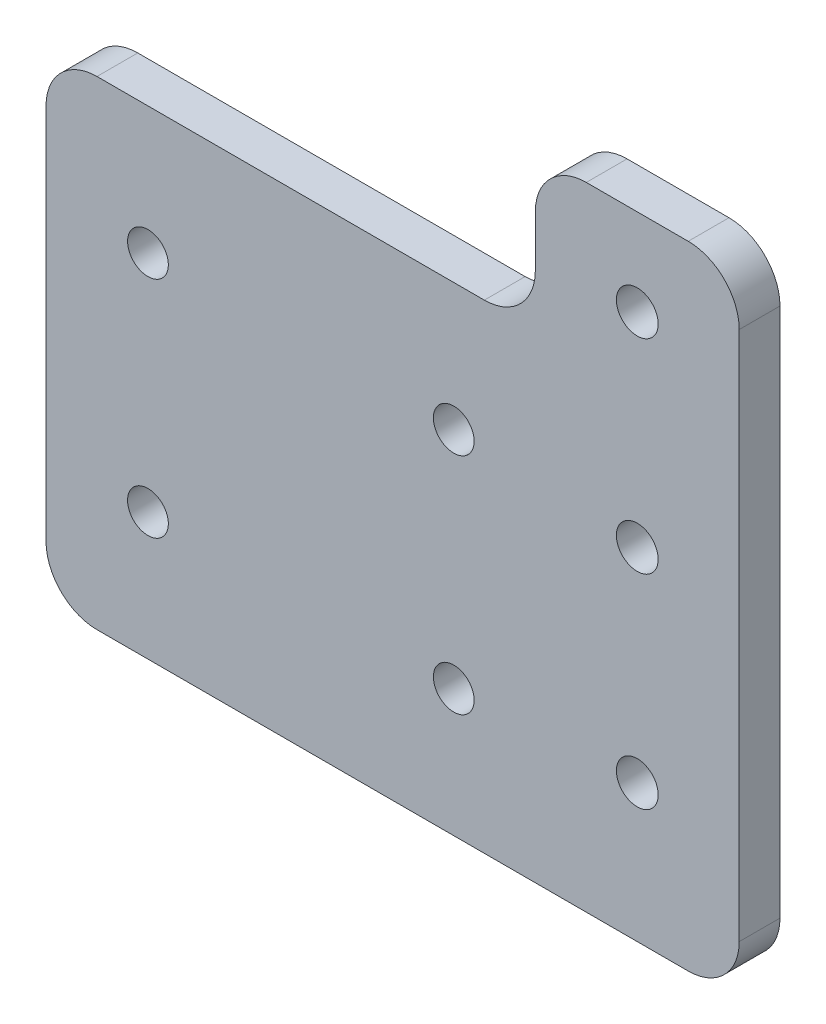
ISO-10303-21;
HEADER;
FILE_DESCRIPTION(('STEP AP214'),'2;1');
FILE_NAME('part.step','',(''),(''),'','','');
FILE_SCHEMA(('AUTOMOTIVE_DESIGN { 1 0 10303 214 1 1 1 1 }'));
ENDSEC;
DATA;
#1=APPLICATION_CONTEXT('core data for automotive mechanical design processes');
#2=APPLICATION_PROTOCOL_DEFINITION('international standard','automotive_design',2000,#1);
#3=PRODUCT_CONTEXT('',#1,'mechanical');
#4=PRODUCT('Part','Part','',(#3));
#5=PRODUCT_RELATED_PRODUCT_CATEGORY('part','',(#4));
#6=PRODUCT_DEFINITION_FORMATION('','',#4);
#7=PRODUCT_DEFINITION_CONTEXT('part definition',#1,'design');
#8=PRODUCT_DEFINITION('design','',#6,#7);
#9=PRODUCT_DEFINITION_SHAPE('','',#8);
#10=(LENGTH_UNIT() NAMED_UNIT(*) SI_UNIT(.MILLI.,.METRE.));
#11=(NAMED_UNIT(*) PLANE_ANGLE_UNIT() SI_UNIT($,.RADIAN.));
#12=(NAMED_UNIT(*) SI_UNIT($,.STERADIAN.) SOLID_ANGLE_UNIT());
#13=UNCERTAINTY_MEASURE_WITH_UNIT(LENGTH_MEASURE(1.E-05),#10,'distance_accuracy_value','');
#14=(GEOMETRIC_REPRESENTATION_CONTEXT(3) GLOBAL_UNCERTAINTY_ASSIGNED_CONTEXT((#13)) GLOBAL_UNIT_ASSIGNED_CONTEXT((#10,
#11,#12)) REPRESENTATION_CONTEXT('',''));
#15=CARTESIAN_POINT('',(0.,0.,0.));
#16=DIRECTION('',(0.,0.,1.));
#17=DIRECTION('',(1.,0.,0.));
#18=AXIS2_PLACEMENT_3D('',#15,#16,#17);
#19=CARTESIAN_POINT('',(0.,47.,4.));
#20=DIRECTION('',(0.,-1.,0.));
#21=DIRECTION('',(0.,0.,-1.));
#22=AXIS2_PLACEMENT_3D('',#19,#20,#21);
#23=PLANE('',#22);
#24=DIRECTION('',(-1.,0.,0.));
#25=VECTOR('',#24,1.);
#26=CARTESIAN_POINT('',(0.,47.,4.));
#27=LINE('',#26,#25);
#28=CARTESIAN_POINT('',(43.,47.,4.));
#29=VERTEX_POINT('',#28);
#30=CARTESIAN_POINT('',(4.99999999999998,47.,4.));
#31=VERTEX_POINT('',#30);
#32=EDGE_CURVE('E172',#29,#31,#27,.T.);
#33=ORIENTED_EDGE('',*,*,#32,.F.);
#34=DIRECTION('',(0.,0.,1.));
#35=VECTOR('',#34,1.);
#36=CARTESIAN_POINT('',(43.,47.,4.));
#37=LINE('',#36,#35);
#38=CARTESIAN_POINT('',(43.,47.,0.));
#39=VERTEX_POINT('',#38);
#40=EDGE_CURVE('E210',#29,#39,#37,.F.);
#41=ORIENTED_EDGE('',*,*,#40,.T.);
#42=DIRECTION('',(-1.,0.,0.));
#43=VECTOR('',#42,1.);
#44=CARTESIAN_POINT('',(0.,47.,0.));
#45=LINE('',#44,#43);
#46=CARTESIAN_POINT('',(4.99999999999998,47.,0.));
#47=VERTEX_POINT('',#46);
#48=EDGE_CURVE('E159',#39,#47,#45,.T.);
#49=ORIENTED_EDGE('',*,*,#48,.T.);
#50=DIRECTION('',(0.,0.,-1.));
#51=VECTOR('',#50,1.);
#52=CARTESIAN_POINT('',(4.99999999999998,47.,4.));
#53=LINE('',#52,#51);
#54=EDGE_CURVE('E56',#47,#31,#53,.F.);
#55=ORIENTED_EDGE('',*,*,#54,.T.);
#56=EDGE_LOOP('',(#33,#41,#49,#55));
#57=FACE_BOUND('',#56,.T.);
#58=ADVANCED_FACE('F41',(#57),#23,.F.);
#59=CARTESIAN_POINT('',(0.,0.,4.));
#60=DIRECTION('',(1.,0.,0.));
#61=DIRECTION('',(0.,1.,0.));
#62=AXIS2_PLACEMENT_3D('',#59,#60,#61);
#63=PLANE('',#62);
#64=DIRECTION('',(0.,-1.,0.));
#65=VECTOR('',#64,1.);
#66=CARTESIAN_POINT('',(0.,0.,0.));
#67=LINE('',#66,#65);
#68=CARTESIAN_POINT('',(0.,42.,0.));
#69=VERTEX_POINT('',#68);
#70=CARTESIAN_POINT('',(0.,5.,0.));
#71=VERTEX_POINT('',#70);
#72=EDGE_CURVE('E156',#69,#71,#67,.T.);
#73=ORIENTED_EDGE('',*,*,#72,.T.);
#74=DIRECTION('',(0.,0.,-1.));
#75=VECTOR('',#74,1.);
#76=CARTESIAN_POINT('',(0.,5.,4.));
#77=LINE('',#76,#75);
#78=CARTESIAN_POINT('',(0.,5.,4.));
#79=VERTEX_POINT('',#78);
#80=EDGE_CURVE('E134',#71,#79,#77,.F.);
#81=ORIENTED_EDGE('',*,*,#80,.T.);
#82=DIRECTION('',(0.,-1.,0.));
#83=VECTOR('',#82,1.);
#84=CARTESIAN_POINT('',(0.,0.,4.));
#85=LINE('',#84,#83);
#86=CARTESIAN_POINT('',(0.,42.,4.));
#87=VERTEX_POINT('',#86);
#88=EDGE_CURVE('E166',#87,#79,#85,.T.);
#89=ORIENTED_EDGE('',*,*,#88,.F.);
#90=DIRECTION('',(0.,0.,-1.));
#91=VECTOR('',#90,1.);
#92=CARTESIAN_POINT('',(0.,42.,4.));
#93=LINE('',#92,#91);
#94=EDGE_CURVE('E139',#87,#69,#93,.T.);
#95=ORIENTED_EDGE('',*,*,#94,.T.);
#96=EDGE_LOOP('',(#73,#81,#89,#95));
#97=FACE_BOUND('',#96,.T.);
#98=ADVANCED_FACE('F280',(#97),#63,.F.);
#99=CARTESIAN_POINT('',(0.,0.,4.));
#100=DIRECTION('',(0.,1.,0.));
#101=DIRECTION('',(0.,0.,1.));
#102=AXIS2_PLACEMENT_3D('',#99,#100,#101);
#103=PLANE('',#102);
#104=DIRECTION('',(1.,0.,0.));
#105=VECTOR('',#104,1.);
#106=CARTESIAN_POINT('',(0.,0.,4.));
#107=LINE('',#106,#105);
#108=CARTESIAN_POINT('',(5.,0.,4.));
#109=VERTEX_POINT('',#108);
#110=CARTESIAN_POINT('',(63.,0.,4.));
#111=VERTEX_POINT('',#110);
#112=EDGE_CURVE('E149',#109,#111,#107,.T.);
#113=ORIENTED_EDGE('',*,*,#112,.F.);
#114=DIRECTION('',(0.,0.,-1.));
#115=VECTOR('',#114,1.);
#116=CARTESIAN_POINT('',(5.,0.,4.));
#117=LINE('',#116,#115);
#118=CARTESIAN_POINT('',(5.,0.,0.));
#119=VERTEX_POINT('',#118);
#120=EDGE_CURVE('E133',#109,#119,#117,.T.);
#121=ORIENTED_EDGE('',*,*,#120,.T.);
#122=DIRECTION('',(1.,0.,0.));
#123=VECTOR('',#122,1.);
#124=CARTESIAN_POINT('',(0.,0.,0.));
#125=LINE('',#124,#123);
#126=CARTESIAN_POINT('',(63.,0.,0.));
#127=VERTEX_POINT('',#126);
#128=EDGE_CURVE('E146',#119,#127,#125,.T.);
#129=ORIENTED_EDGE('',*,*,#128,.T.);
#130=DIRECTION('',(0.,0.,-1.));
#131=VECTOR('',#130,1.);
#132=CARTESIAN_POINT('',(63.,0.,4.));
#133=LINE('',#132,#131);
#134=EDGE_CURVE('E151',#127,#111,#133,.F.);
#135=ORIENTED_EDGE('',*,*,#134,.T.);
#136=EDGE_LOOP('',(#113,#121,#129,#135));
#137=FACE_BOUND('',#136,.T.);
#138=ADVANCED_FACE('F145',(#137),#103,.F.);
#139=CARTESIAN_POINT('',(68.,0.,4.));
#140=DIRECTION('',(-1.,0.,0.));
#141=DIRECTION('',(0.,-1.,0.));
#142=AXIS2_PLACEMENT_3D('',#139,#140,#141);
#143=PLANE('',#142);
#144=DIRECTION('',(0.,1.,0.));
#145=VECTOR('',#144,1.);
#146=CARTESIAN_POINT('',(68.,0.,4.));
#147=LINE('',#146,#145);
#148=CARTESIAN_POINT('',(68.,5.,4.));
#149=VERTEX_POINT('',#148);
#150=CARTESIAN_POINT('',(68.,57.,4.));
#151=VERTEX_POINT('',#150);
#152=EDGE_CURVE('E272',#149,#151,#147,.T.);
#153=ORIENTED_EDGE('',*,*,#152,.F.);
#154=DIRECTION('',(0.,0.,-1.));
#155=VECTOR('',#154,1.);
#156=CARTESIAN_POINT('',(68.,5.,4.));
#157=LINE('',#156,#155);
#158=CARTESIAN_POINT('',(68.,5.,0.));
#159=VERTEX_POINT('',#158);
#160=EDGE_CURVE('E196',#149,#159,#157,.T.);
#161=ORIENTED_EDGE('',*,*,#160,.T.);
#162=DIRECTION('',(0.,1.,0.));
#163=VECTOR('',#162,1.);
#164=CARTESIAN_POINT('',(68.,0.,0.));
#165=LINE('',#164,#163);
#166=CARTESIAN_POINT('',(68.,57.,0.));
#167=VERTEX_POINT('',#166);
#168=EDGE_CURVE('E155',#159,#167,#165,.T.);
#169=ORIENTED_EDGE('',*,*,#168,.T.);
#170=DIRECTION('',(0.,0.,1.));
#171=VECTOR('',#170,1.);
#172=CARTESIAN_POINT('',(68.,57.,4.));
#173=LINE('',#172,#171);
#174=EDGE_CURVE('E193',#167,#151,#173,.T.);
#175=ORIENTED_EDGE('',*,*,#174,.T.);
#176=EDGE_LOOP('',(#153,#161,#169,#175));
#177=FACE_BOUND('',#176,.T.);
#178=ADVANCED_FACE('F287',(#177),#143,.F.);
#179=CARTESIAN_POINT('',(0.,0.,4.));
#180=DIRECTION('',(0.,0.,-1.));
#181=DIRECTION('',(-1.,0.,0.));
#182=AXIS2_PLACEMENT_3D('',#179,#180,#181);
#183=PLANE('',#182);
#184=CARTESIAN_POINT('',(57.9999999999999,53.5,4.));
#185=DIRECTION('',(0.,0.,1.));
#186=DIRECTION('',(1.,0.,0.));
#187=AXIS2_PLACEMENT_3D('',#184,#185,#186);
#188=CIRCLE('',#187,2.04999999999999);
#189=CARTESIAN_POINT('',(60.0499999999999,53.5,4.));
#190=VERTEX_POINT('',#189);
#191=EDGE_CURVE('E171',#190,#190,#188,.T.);
#192=ORIENTED_EDGE('',*,*,#191,.F.);
#193=EDGE_LOOP('',(#192));
#194=FACE_BOUND('',#193,.T.);
#195=CARTESIAN_POINT('',(40.,12.5,4.));
#196=DIRECTION('',(0.,0.,1.));
#197=DIRECTION('',(-1.,0.,0.));
#198=AXIS2_PLACEMENT_3D('',#195,#196,#197);
#199=CIRCLE('',#198,2.);
#200=CARTESIAN_POINT('',(38.,12.5,4.));
#201=VERTEX_POINT('',#200);
#202=EDGE_CURVE('E249',#201,#201,#199,.T.);
#203=ORIENTED_EDGE('',*,*,#202,.F.);
#204=EDGE_LOOP('',(#203));
#205=FACE_BOUND('',#204,.T.);
#206=CARTESIAN_POINT('',(40.,34.5,4.));
#207=DIRECTION('',(0.,0.,1.));
#208=DIRECTION('',(1.,0.,0.));
#209=AXIS2_PLACEMENT_3D('',#206,#207,#208);
#210=CIRCLE('',#209,2.);
#211=CARTESIAN_POINT('',(42.,34.5,4.));
#212=VERTEX_POINT('',#211);
#213=EDGE_CURVE('E242',#212,#212,#210,.T.);
#214=ORIENTED_EDGE('',*,*,#213,.F.);
#215=EDGE_LOOP('',(#214));
#216=FACE_BOUND('',#215,.T.);
#217=CARTESIAN_POINT('',(58.,33.5,4.));
#218=DIRECTION('',(0.,0.,1.));
#219=DIRECTION('',(1.,0.,0.));
#220=AXIS2_PLACEMENT_3D('',#217,#218,#219);
#221=CIRCLE('',#220,2.04999999999999);
#222=CARTESIAN_POINT('',(60.05,33.5,4.));
#223=VERTEX_POINT('',#222);
#224=EDGE_CURVE('E261',#223,#223,#221,.T.);
#225=ORIENTED_EDGE('',*,*,#224,.F.);
#226=EDGE_LOOP('',(#225));
#227=FACE_BOUND('',#226,.T.);
#228=CARTESIAN_POINT('',(10.,12.5,4.));
#229=DIRECTION('',(0.,0.,1.));
#230=DIRECTION('',(-1.,0.,0.));
#231=AXIS2_PLACEMENT_3D('',#228,#229,#230);
#232=CIRCLE('',#231,2.);
#233=CARTESIAN_POINT('',(8.,12.5,4.));
#234=VERTEX_POINT('',#233);
#235=EDGE_CURVE('E254',#234,#234,#232,.T.);
#236=ORIENTED_EDGE('',*,*,#235,.F.);
#237=EDGE_LOOP('',(#236));
#238=FACE_BOUND('',#237,.T.);
#239=CARTESIAN_POINT('',(58.,13.5,4.));
#240=DIRECTION('',(0.,0.,1.));
#241=DIRECTION('',(-1.,0.,0.));
#242=AXIS2_PLACEMENT_3D('',#239,#240,#241);
#243=CIRCLE('',#242,2.04999999999999);
#244=CARTESIAN_POINT('',(55.95,13.5,4.));
#245=VERTEX_POINT('',#244);
#246=EDGE_CURVE('E235',#245,#245,#243,.T.);
#247=ORIENTED_EDGE('',*,*,#246,.F.);
#248=EDGE_LOOP('',(#247));
#249=FACE_BOUND('',#248,.T.);
#250=CARTESIAN_POINT('',(10.,34.5,4.));
#251=DIRECTION('',(0.,0.,1.));
#252=DIRECTION('',(1.,0.,0.));
#253=AXIS2_PLACEMENT_3D('',#250,#251,#252);
#254=CIRCLE('',#253,2.);
#255=CARTESIAN_POINT('',(12.,34.5,4.));
#256=VERTEX_POINT('',#255);
#257=EDGE_CURVE('E257',#256,#256,#254,.T.);
#258=ORIENTED_EDGE('',*,*,#257,.F.);
#259=EDGE_LOOP('',(#258));
#260=FACE_BOUND('',#259,.T.);
#261=ORIENTED_EDGE('',*,*,#88,.T.);
#262=CARTESIAN_POINT('',(5.,5.,4.));
#263=DIRECTION('',(0.,0.,-1.));
#264=DIRECTION('',(-1.,0.,0.));
#265=AXIS2_PLACEMENT_3D('',#262,#263,#264);
#266=CIRCLE('',#265,5.);
#267=EDGE_CURVE('E191',#79,#109,#266,.F.);
#268=ORIENTED_EDGE('',*,*,#267,.T.);
#269=ORIENTED_EDGE('',*,*,#112,.T.);
#270=CARTESIAN_POINT('',(63.,5.,4.));
#271=DIRECTION('',(0.,0.,-1.));
#272=DIRECTION('',(-1.,0.,0.));
#273=AXIS2_PLACEMENT_3D('',#270,#271,#272);
#274=CIRCLE('',#273,5.);
#275=EDGE_CURVE('E189',#111,#149,#274,.F.);
#276=ORIENTED_EDGE('',*,*,#275,.T.);
#277=ORIENTED_EDGE('',*,*,#152,.T.);
#278=CARTESIAN_POINT('',(63.,57.,4.));
#279=DIRECTION('',(0.,0.,-1.));
#280=DIRECTION('',(-1.,0.,0.));
#281=AXIS2_PLACEMENT_3D('',#278,#279,#280);
#282=CIRCLE('',#281,5.);
#283=CARTESIAN_POINT('',(63.,62.,4.));
#284=VERTEX_POINT('',#283);
#285=EDGE_CURVE('E183',#151,#284,#282,.F.);
#286=ORIENTED_EDGE('',*,*,#285,.T.);
#287=DIRECTION('',(-1.,0.,0.));
#288=VECTOR('',#287,1.);
#289=CARTESIAN_POINT('',(68.,62.,4.));
#290=LINE('',#289,#288);
#291=CARTESIAN_POINT('',(53.,62.,4.));
#292=VERTEX_POINT('',#291);
#293=EDGE_CURVE('E170',#284,#292,#290,.T.);
#294=ORIENTED_EDGE('',*,*,#293,.T.);
#295=CARTESIAN_POINT('',(53.,57.,4.));
#296=DIRECTION('',(0.,0.,-1.));
#297=DIRECTION('',(-1.,0.,0.));
#298=AXIS2_PLACEMENT_3D('',#295,#296,#297);
#299=CIRCLE('',#298,5.);
#300=CARTESIAN_POINT('',(48.,57.,4.));
#301=VERTEX_POINT('',#300);
#302=EDGE_CURVE('E187',#292,#301,#299,.F.);
#303=ORIENTED_EDGE('',*,*,#302,.T.);
#304=DIRECTION('',(0.,-1.,0.));
#305=VECTOR('',#304,1.);
#306=CARTESIAN_POINT('',(48.,47.,4.));
#307=LINE('',#306,#305);
#308=CARTESIAN_POINT('',(48.,52.,4.));
#309=VERTEX_POINT('',#308);
#310=EDGE_CURVE('E222',#301,#309,#307,.T.);
#311=ORIENTED_EDGE('',*,*,#310,.T.);
#312=CARTESIAN_POINT('',(43.,52.,4.));
#313=DIRECTION('',(0.,0.,-1.));
#314=DIRECTION('',(-1.,0.,0.));
#315=AXIS2_PLACEMENT_3D('',#312,#313,#314);
#316=CIRCLE('',#315,5.);
#317=EDGE_CURVE('E49',#309,#29,#316,.T.);
#318=ORIENTED_EDGE('',*,*,#317,.T.);
#319=ORIENTED_EDGE('',*,*,#32,.T.);
#320=CARTESIAN_POINT('',(4.99999999999998,42.,4.));
#321=DIRECTION('',(0.,0.,-1.));
#322=DIRECTION('',(-1.,0.,0.));
#323=AXIS2_PLACEMENT_3D('',#320,#321,#322);
#324=CIRCLE('',#323,5.);
#325=EDGE_CURVE('E185',#31,#87,#324,.F.);
#326=ORIENTED_EDGE('',*,*,#325,.T.);
#327=EDGE_LOOP('',(#261,#268,#269,#276,#277,#286,#294,#303,#311,#318,#319,#326));
#328=FACE_BOUND('',#327,.T.);
#329=ADVANCED_FACE('F226',(#194,#205,#216,#227,#238,#249,#260,#328),#183,.F.);
#330=CARTESIAN_POINT('',(0.,0.,0.));
#331=DIRECTION('',(0.,0.,-1.));
#332=DIRECTION('',(-1.,0.,0.));
#333=AXIS2_PLACEMENT_3D('',#330,#331,#332);
#334=PLANE('',#333);
#335=CARTESIAN_POINT('',(57.9999999999999,53.5,0.));
#336=DIRECTION('',(0.,0.,-1.));
#337=DIRECTION('',(-1.,0.,0.));
#338=AXIS2_PLACEMENT_3D('',#335,#336,#337);
#339=CIRCLE('',#338,2.04999999999999);
#340=CARTESIAN_POINT('',(55.9499999999999,53.5,0.));
#341=VERTEX_POINT('',#340);
#342=EDGE_CURVE('E167',#341,#341,#339,.T.);
#343=ORIENTED_EDGE('',*,*,#342,.F.);
#344=EDGE_LOOP('',(#343));
#345=FACE_BOUND('',#344,.T.);
#346=CARTESIAN_POINT('',(40.,12.5,0.));
#347=DIRECTION('',(0.,0.,1.));
#348=DIRECTION('',(-1.,0.,0.));
#349=AXIS2_PLACEMENT_3D('',#346,#347,#348);
#350=CIRCLE('',#349,2.);
#351=CARTESIAN_POINT('',(38.,12.5,0.));
#352=VERTEX_POINT('',#351);
#353=EDGE_CURVE('E238',#352,#352,#350,.T.);
#354=ORIENTED_EDGE('',*,*,#353,.T.);
#355=EDGE_LOOP('',(#354));
#356=FACE_BOUND('',#355,.T.);
#357=CARTESIAN_POINT('',(40.,34.5,0.));
#358=DIRECTION('',(0.,0.,1.));
#359=DIRECTION('',(1.,0.,0.));
#360=AXIS2_PLACEMENT_3D('',#357,#358,#359);
#361=CIRCLE('',#360,2.);
#362=CARTESIAN_POINT('',(42.,34.5,0.));
#363=VERTEX_POINT('',#362);
#364=EDGE_CURVE('E246',#363,#363,#361,.T.);
#365=ORIENTED_EDGE('',*,*,#364,.T.);
#366=EDGE_LOOP('',(#365));
#367=FACE_BOUND('',#366,.T.);
#368=CARTESIAN_POINT('',(58.,33.5,0.));
#369=DIRECTION('',(0.,0.,1.));
#370=DIRECTION('',(1.,0.,0.));
#371=AXIS2_PLACEMENT_3D('',#368,#369,#370);
#372=CIRCLE('',#371,2.04999999999999);
#373=CARTESIAN_POINT('',(60.05,33.5,0.));
#374=VERTEX_POINT('',#373);
#375=EDGE_CURVE('E245',#374,#374,#372,.T.);
#376=ORIENTED_EDGE('',*,*,#375,.T.);
#377=EDGE_LOOP('',(#376));
#378=FACE_BOUND('',#377,.T.);
#379=CARTESIAN_POINT('',(10.,12.5,0.));
#380=DIRECTION('',(0.,0.,1.));
#381=DIRECTION('',(-1.,0.,0.));
#382=AXIS2_PLACEMENT_3D('',#379,#380,#381);
#383=CIRCLE('',#382,2.);
#384=CARTESIAN_POINT('',(8.,12.5,0.));
#385=VERTEX_POINT('',#384);
#386=EDGE_CURVE('E258',#385,#385,#383,.T.);
#387=ORIENTED_EDGE('',*,*,#386,.T.);
#388=EDGE_LOOP('',(#387));
#389=FACE_BOUND('',#388,.T.);
#390=CARTESIAN_POINT('',(58.,13.5,0.));
#391=DIRECTION('',(0.,0.,1.));
#392=DIRECTION('',(-1.,0.,0.));
#393=AXIS2_PLACEMENT_3D('',#390,#391,#392);
#394=CIRCLE('',#393,2.04999999999999);
#395=CARTESIAN_POINT('',(55.95,13.5,0.));
#396=VERTEX_POINT('',#395);
#397=EDGE_CURVE('E239',#396,#396,#394,.T.);
#398=ORIENTED_EDGE('',*,*,#397,.T.);
#399=EDGE_LOOP('',(#398));
#400=FACE_BOUND('',#399,.T.);
#401=CARTESIAN_POINT('',(10.,34.5,0.));
#402=DIRECTION('',(0.,0.,1.));
#403=DIRECTION('',(1.,0.,0.));
#404=AXIS2_PLACEMENT_3D('',#401,#402,#403);
#405=CIRCLE('',#404,2.);
#406=CARTESIAN_POINT('',(12.,34.5,0.));
#407=VERTEX_POINT('',#406);
#408=EDGE_CURVE('E161',#407,#407,#405,.T.);
#409=ORIENTED_EDGE('',*,*,#408,.T.);
#410=EDGE_LOOP('',(#409));
#411=FACE_BOUND('',#410,.T.);
#412=ORIENTED_EDGE('',*,*,#128,.F.);
#413=CARTESIAN_POINT('',(5.,5.,0.));
#414=DIRECTION('',(0.,0.,-1.));
#415=DIRECTION('',(-1.,0.,0.));
#416=AXIS2_PLACEMENT_3D('',#413,#414,#415);
#417=CIRCLE('',#416,5.);
#418=EDGE_CURVE('E129',#119,#71,#417,.T.);
#419=ORIENTED_EDGE('',*,*,#418,.T.);
#420=ORIENTED_EDGE('',*,*,#72,.F.);
#421=CARTESIAN_POINT('',(4.99999999999998,42.,0.));
#422=DIRECTION('',(0.,0.,-1.));
#423=DIRECTION('',(-1.,0.,0.));
#424=AXIS2_PLACEMENT_3D('',#421,#422,#423);
#425=CIRCLE('',#424,5.);
#426=EDGE_CURVE('E175',#69,#47,#425,.T.);
#427=ORIENTED_EDGE('',*,*,#426,.T.);
#428=ORIENTED_EDGE('',*,*,#48,.F.);
#429=CARTESIAN_POINT('',(43.,52.,0.));
#430=DIRECTION('',(0.,0.,-1.));
#431=DIRECTION('',(-1.,0.,0.));
#432=AXIS2_PLACEMENT_3D('',#429,#430,#431);
#433=CIRCLE('',#432,5.);
#434=CARTESIAN_POINT('',(48.,52.,0.));
#435=VERTEX_POINT('',#434);
#436=EDGE_CURVE('E11',#39,#435,#433,.F.);
#437=ORIENTED_EDGE('',*,*,#436,.T.);
#438=DIRECTION('',(0.,-1.,0.));
#439=VECTOR('',#438,1.);
#440=CARTESIAN_POINT('',(48.,47.,0.));
#441=LINE('',#440,#439);
#442=CARTESIAN_POINT('',(48.,57.,0.));
#443=VERTEX_POINT('',#442);
#444=EDGE_CURVE('E224',#443,#435,#441,.T.);
#445=ORIENTED_EDGE('',*,*,#444,.F.);
#446=CARTESIAN_POINT('',(53.,57.,0.));
#447=DIRECTION('',(0.,0.,-1.));
#448=DIRECTION('',(-1.,0.,0.));
#449=AXIS2_PLACEMENT_3D('',#446,#447,#448);
#450=CIRCLE('',#449,5.);
#451=CARTESIAN_POINT('',(53.,62.,0.));
#452=VERTEX_POINT('',#451);
#453=EDGE_CURVE('E177',#443,#452,#450,.T.);
#454=ORIENTED_EDGE('',*,*,#453,.T.);
#455=DIRECTION('',(-1.,0.,0.));
#456=VECTOR('',#455,1.);
#457=CARTESIAN_POINT('',(68.,62.,0.));
#458=LINE('',#457,#456);
#459=CARTESIAN_POINT('',(63.,62.,0.));
#460=VERTEX_POINT('',#459);
#461=EDGE_CURVE('E228',#460,#452,#458,.T.);
#462=ORIENTED_EDGE('',*,*,#461,.F.);
#463=CARTESIAN_POINT('',(63.,57.,0.));
#464=DIRECTION('',(0.,0.,-1.));
#465=DIRECTION('',(-1.,0.,0.));
#466=AXIS2_PLACEMENT_3D('',#463,#464,#465);
#467=CIRCLE('',#466,5.);
#468=EDGE_CURVE('E150',#460,#167,#467,.T.);
#469=ORIENTED_EDGE('',*,*,#468,.T.);
#470=ORIENTED_EDGE('',*,*,#168,.F.);
#471=CARTESIAN_POINT('',(63.,5.,0.));
#472=DIRECTION('',(0.,0.,-1.));
#473=DIRECTION('',(-1.,0.,0.));
#474=AXIS2_PLACEMENT_3D('',#471,#472,#473);
#475=CIRCLE('',#474,5.);
#476=EDGE_CURVE('E140',#159,#127,#475,.T.);
#477=ORIENTED_EDGE('',*,*,#476,.T.);
#478=EDGE_LOOP('',(#412,#419,#420,#427,#428,#437,#445,#454,#462,#469,#470,#477));
#479=FACE_BOUND('',#478,.T.);
#480=ADVANCED_FACE('F153',(#345,#356,#367,#378,#389,#400,#411,#479),#334,.T.);
#481=CARTESIAN_POINT('',(10.,34.5,0.));
#482=DIRECTION('',(0.,0.,1.));
#483=DIRECTION('',(1.,0.,0.));
#484=AXIS2_PLACEMENT_3D('',#481,#482,#483);
#485=CYLINDRICAL_SURFACE('',#484,2.);
#486=ORIENTED_EDGE('',*,*,#408,.F.);
#487=EDGE_LOOP('',(#486));
#488=FACE_BOUND('',#487,.T.);
#489=ORIENTED_EDGE('',*,*,#257,.T.);
#490=EDGE_LOOP('',(#489));
#491=FACE_BOUND('',#490,.T.);
#492=ADVANCED_FACE('F321',(#488,#491),#485,.F.);
#493=CARTESIAN_POINT('',(58.,13.5,0.));
#494=DIRECTION('',(0.,0.,1.));
#495=DIRECTION('',(1.,0.,0.));
#496=AXIS2_PLACEMENT_3D('',#493,#494,#495);
#497=CYLINDRICAL_SURFACE('',#496,2.04999999999999);
#498=ORIENTED_EDGE('',*,*,#397,.F.);
#499=EDGE_LOOP('',(#498));
#500=FACE_BOUND('',#499,.T.);
#501=ORIENTED_EDGE('',*,*,#246,.T.);
#502=EDGE_LOOP('',(#501));
#503=FACE_BOUND('',#502,.T.);
#504=ADVANCED_FACE('F323',(#500,#503),#497,.F.);
#505=CARTESIAN_POINT('',(10.,12.5,0.));
#506=DIRECTION('',(0.,0.,1.));
#507=DIRECTION('',(1.,0.,0.));
#508=AXIS2_PLACEMENT_3D('',#505,#506,#507);
#509=CYLINDRICAL_SURFACE('',#508,2.);
#510=ORIENTED_EDGE('',*,*,#386,.F.);
#511=EDGE_LOOP('',(#510));
#512=FACE_BOUND('',#511,.T.);
#513=ORIENTED_EDGE('',*,*,#235,.T.);
#514=EDGE_LOOP('',(#513));
#515=FACE_BOUND('',#514,.T.);
#516=ADVANCED_FACE('F329',(#512,#515),#509,.F.);
#517=CARTESIAN_POINT('',(58.,33.5,0.));
#518=DIRECTION('',(0.,0.,1.));
#519=DIRECTION('',(1.,0.,0.));
#520=AXIS2_PLACEMENT_3D('',#517,#518,#519);
#521=CYLINDRICAL_SURFACE('',#520,2.04999999999999);
#522=ORIENTED_EDGE('',*,*,#375,.F.);
#523=EDGE_LOOP('',(#522));
#524=FACE_BOUND('',#523,.T.);
#525=ORIENTED_EDGE('',*,*,#224,.T.);
#526=EDGE_LOOP('',(#525));
#527=FACE_BOUND('',#526,.T.);
#528=ADVANCED_FACE('F464',(#524,#527),#521,.F.);
#529=CARTESIAN_POINT('',(40.,34.5,0.));
#530=DIRECTION('',(0.,0.,1.));
#531=DIRECTION('',(1.,0.,0.));
#532=AXIS2_PLACEMENT_3D('',#529,#530,#531);
#533=CYLINDRICAL_SURFACE('',#532,2.);
#534=ORIENTED_EDGE('',*,*,#364,.F.);
#535=EDGE_LOOP('',(#534));
#536=FACE_BOUND('',#535,.T.);
#537=ORIENTED_EDGE('',*,*,#213,.T.);
#538=EDGE_LOOP('',(#537));
#539=FACE_BOUND('',#538,.T.);
#540=ADVANCED_FACE('F454',(#536,#539),#533,.F.);
#541=CARTESIAN_POINT('',(40.,12.5,0.));
#542=DIRECTION('',(0.,0.,1.));
#543=DIRECTION('',(1.,0.,0.));
#544=AXIS2_PLACEMENT_3D('',#541,#542,#543);
#545=CYLINDRICAL_SURFACE('',#544,2.);
#546=ORIENTED_EDGE('',*,*,#353,.F.);
#547=EDGE_LOOP('',(#546));
#548=FACE_BOUND('',#547,.T.);
#549=ORIENTED_EDGE('',*,*,#202,.T.);
#550=EDGE_LOOP('',(#549));
#551=FACE_BOUND('',#550,.T.);
#552=ADVANCED_FACE('F417',(#548,#551),#545,.F.);
#553=CARTESIAN_POINT('',(48.,47.,0.));
#554=DIRECTION('',(-1.,0.,0.));
#555=DIRECTION('',(0.,0.,1.));
#556=AXIS2_PLACEMENT_3D('',#553,#554,#555);
#557=PLANE('',#556);
#558=ORIENTED_EDGE('',*,*,#310,.F.);
#559=DIRECTION('',(0.,0.,1.));
#560=VECTOR('',#559,1.);
#561=CARTESIAN_POINT('',(48.,57.,0.));
#562=LINE('',#561,#560);
#563=EDGE_CURVE('E207',#301,#443,#562,.F.);
#564=ORIENTED_EDGE('',*,*,#563,.T.);
#565=ORIENTED_EDGE('',*,*,#444,.T.);
#566=DIRECTION('',(0.,0.,1.));
#567=VECTOR('',#566,1.);
#568=CARTESIAN_POINT('',(48.,52.,0.));
#569=LINE('',#568,#567);
#570=EDGE_CURVE('E204',#435,#309,#569,.T.);
#571=ORIENTED_EDGE('',*,*,#570,.T.);
#572=EDGE_LOOP('',(#558,#564,#565,#571));
#573=FACE_BOUND('',#572,.T.);
#574=ADVANCED_FACE('F221',(#573),#557,.T.);
#575=CARTESIAN_POINT('',(68.,62.,0.));
#576=DIRECTION('',(0.,1.,0.));
#577=DIRECTION('',(0.,0.,1.));
#578=AXIS2_PLACEMENT_3D('',#575,#576,#577);
#579=PLANE('',#578);
#580=ORIENTED_EDGE('',*,*,#461,.T.);
#581=DIRECTION('',(0.,0.,1.));
#582=VECTOR('',#581,1.);
#583=CARTESIAN_POINT('',(53.,62.,0.));
#584=LINE('',#583,#582);
#585=EDGE_CURVE('E201',#452,#292,#584,.T.);
#586=ORIENTED_EDGE('',*,*,#585,.T.);
#587=ORIENTED_EDGE('',*,*,#293,.F.);
#588=DIRECTION('',(0.,0.,1.));
#589=VECTOR('',#588,1.);
#590=CARTESIAN_POINT('',(63.,62.,0.));
#591=LINE('',#590,#589);
#592=EDGE_CURVE('E199',#284,#460,#591,.F.);
#593=ORIENTED_EDGE('',*,*,#592,.T.);
#594=EDGE_LOOP('',(#580,#586,#587,#593));
#595=FACE_BOUND('',#594,.T.);
#596=ADVANCED_FACE('F295',(#595),#579,.T.);
#597=CARTESIAN_POINT('',(57.9999999999999,53.5,-8.));
#598=DIRECTION('',(0.,0.,1.));
#599=DIRECTION('',(1.,0.,0.));
#600=AXIS2_PLACEMENT_3D('',#597,#598,#599);
#601=CYLINDRICAL_SURFACE('',#600,2.04999999999999);
#602=ORIENTED_EDGE('',*,*,#342,.T.);
#603=EDGE_LOOP('',(#602));
#604=FACE_BOUND('',#603,.T.);
#605=ORIENTED_EDGE('',*,*,#191,.T.);
#606=EDGE_LOOP('',(#605));
#607=FACE_BOUND('',#606,.T.);
#608=ADVANCED_FACE('F304',(#604,#607),#601,.F.);
#609=CARTESIAN_POINT('',(5.,5.,4.));
#610=DIRECTION('',(0.,0.,-1.));
#611=DIRECTION('',(-1.,0.,0.));
#612=AXIS2_PLACEMENT_3D('',#609,#610,#611);
#613=CYLINDRICAL_SURFACE('',#612,5.);
#614=ORIENTED_EDGE('',*,*,#267,.F.);
#615=ORIENTED_EDGE('',*,*,#80,.F.);
#616=ORIENTED_EDGE('',*,*,#418,.F.);
#617=ORIENTED_EDGE('',*,*,#120,.F.);
#618=EDGE_LOOP('',(#614,#615,#616,#617));
#619=FACE_BOUND('',#618,.T.);
#620=ADVANCED_FACE('F132',(#619),#613,.T.);
#621=CARTESIAN_POINT('',(63.,5.,4.));
#622=DIRECTION('',(0.,0.,-1.));
#623=DIRECTION('',(-1.,0.,0.));
#624=AXIS2_PLACEMENT_3D('',#621,#622,#623);
#625=CYLINDRICAL_SURFACE('',#624,5.);
#626=ORIENTED_EDGE('',*,*,#275,.F.);
#627=ORIENTED_EDGE('',*,*,#134,.F.);
#628=ORIENTED_EDGE('',*,*,#476,.F.);
#629=ORIENTED_EDGE('',*,*,#160,.F.);
#630=EDGE_LOOP('',(#626,#627,#628,#629));
#631=FACE_BOUND('',#630,.T.);
#632=ADVANCED_FACE('F285',(#631),#625,.T.);
#633=CARTESIAN_POINT('',(53.,57.,0.));
#634=DIRECTION('',(0.,0.,1.));
#635=DIRECTION('',(1.,0.,0.));
#636=AXIS2_PLACEMENT_3D('',#633,#634,#635);
#637=CYLINDRICAL_SURFACE('',#636,5.);
#638=ORIENTED_EDGE('',*,*,#453,.F.);
#639=ORIENTED_EDGE('',*,*,#563,.F.);
#640=ORIENTED_EDGE('',*,*,#302,.F.);
#641=ORIENTED_EDGE('',*,*,#585,.F.);
#642=EDGE_LOOP('',(#638,#639,#640,#641));
#643=FACE_BOUND('',#642,.T.);
#644=ADVANCED_FACE('F299',(#643),#637,.T.);
#645=CARTESIAN_POINT('',(43.,52.,0.));
#646=DIRECTION('',(0.,0.,1.));
#647=DIRECTION('',(1.,0.,0.));
#648=AXIS2_PLACEMENT_3D('',#645,#646,#647);
#649=CYLINDRICAL_SURFACE('',#648,5.);
#650=ORIENTED_EDGE('',*,*,#436,.F.);
#651=ORIENTED_EDGE('',*,*,#40,.F.);
#652=ORIENTED_EDGE('',*,*,#317,.F.);
#653=ORIENTED_EDGE('',*,*,#570,.F.);
#654=EDGE_LOOP('',(#650,#651,#652,#653));
#655=FACE_BOUND('',#654,.T.);
#656=ADVANCED_FACE('F218',(#655),#649,.F.);
#657=CARTESIAN_POINT('',(4.99999999999998,42.,4.));
#658=DIRECTION('',(0.,0.,-1.));
#659=DIRECTION('',(-1.,0.,0.));
#660=AXIS2_PLACEMENT_3D('',#657,#658,#659);
#661=CYLINDRICAL_SURFACE('',#660,5.);
#662=ORIENTED_EDGE('',*,*,#325,.F.);
#663=ORIENTED_EDGE('',*,*,#54,.F.);
#664=ORIENTED_EDGE('',*,*,#426,.F.);
#665=ORIENTED_EDGE('',*,*,#94,.F.);
#666=EDGE_LOOP('',(#662,#663,#664,#665));
#667=FACE_BOUND('',#666,.T.);
#668=ADVANCED_FACE('F278',(#667),#661,.T.);
#669=CARTESIAN_POINT('',(63.,57.,4.));
#670=DIRECTION('',(0.,0.,-1.));
#671=DIRECTION('',(-1.,0.,0.));
#672=AXIS2_PLACEMENT_3D('',#669,#670,#671);
#673=CYLINDRICAL_SURFACE('',#672,5.);
#674=ORIENTED_EDGE('',*,*,#468,.F.);
#675=ORIENTED_EDGE('',*,*,#592,.F.);
#676=ORIENTED_EDGE('',*,*,#285,.F.);
#677=ORIENTED_EDGE('',*,*,#174,.F.);
#678=EDGE_LOOP('',(#674,#675,#676,#677));
#679=FACE_BOUND('',#678,.T.);
#680=ADVANCED_FACE('F43',(#679),#673,.T.);
#681=CLOSED_SHELL('',(#58,#98,#138,#178,#329,#480,#492,#504,#516,#528,#540,#552,#574,#596,#608,
#620,#632,#644,#656,#668,#680));
#682=MANIFOLD_SOLID_BREP('B2',#681);
#683=ADVANCED_BREP_SHAPE_REPRESENTATION('',(#18,#682),#14);
#684=SHAPE_DEFINITION_REPRESENTATION(#9,#683);
ENDSEC;
END-ISO-10303-21;
